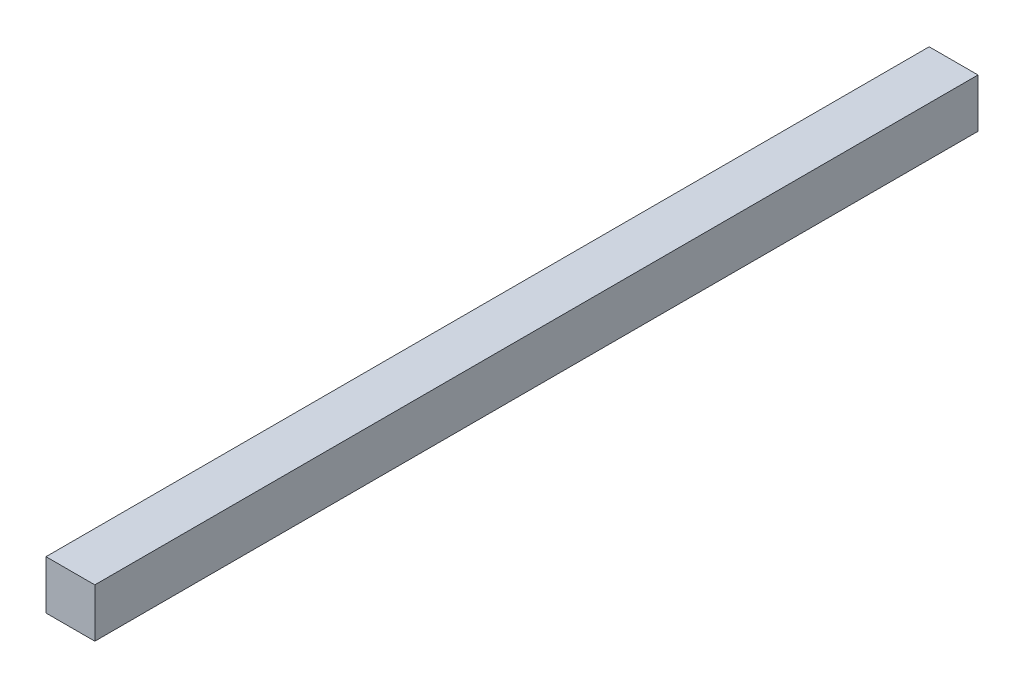
ISO-10303-21;
HEADER;
FILE_DESCRIPTION(('STEP AP214'),'2;1');
FILE_NAME('part.step','',(''),(''),'','','');
FILE_SCHEMA(('AUTOMOTIVE_DESIGN { 1 0 10303 214 1 1 1 1 }'));
ENDSEC;
DATA;
#1=APPLICATION_CONTEXT('core data for automotive mechanical design processes');
#2=APPLICATION_PROTOCOL_DEFINITION('international standard','automotive_design',2000,#1);
#3=PRODUCT_CONTEXT('',#1,'mechanical');
#4=PRODUCT('Part','Part','',(#3));
#5=PRODUCT_RELATED_PRODUCT_CATEGORY('part','',(#4));
#6=PRODUCT_DEFINITION_FORMATION('','',#4);
#7=PRODUCT_DEFINITION_CONTEXT('part definition',#1,'design');
#8=PRODUCT_DEFINITION('design','',#6,#7);
#9=PRODUCT_DEFINITION_SHAPE('','',#8);
#10=(LENGTH_UNIT() NAMED_UNIT(*) SI_UNIT(.MILLI.,.METRE.));
#11=(NAMED_UNIT(*) PLANE_ANGLE_UNIT() SI_UNIT($,.RADIAN.));
#12=(NAMED_UNIT(*) SI_UNIT($,.STERADIAN.) SOLID_ANGLE_UNIT());
#13=UNCERTAINTY_MEASURE_WITH_UNIT(LENGTH_MEASURE(1.E-05),#10,'distance_accuracy_value','');
#14=(GEOMETRIC_REPRESENTATION_CONTEXT(3) GLOBAL_UNCERTAINTY_ASSIGNED_CONTEXT((#13)) GLOBAL_UNIT_ASSIGNED_CONTEXT((#10,
#11,#12)) REPRESENTATION_CONTEXT('',''));
#15=CARTESIAN_POINT('',(0.,0.,0.));
#16=DIRECTION('',(0.,0.,1.));
#17=DIRECTION('',(1.,0.,0.));
#18=AXIS2_PLACEMENT_3D('',#15,#16,#17);
#19=CARTESIAN_POINT('',(4.975,4.975,180.));
#20=DIRECTION('',(-1.,0.,0.));
#21=DIRECTION('',(0.,-1.,0.));
#22=AXIS2_PLACEMENT_3D('',#19,#20,#21);
#23=PLANE('',#22);
#24=DIRECTION('',(0.,1.,0.));
#25=VECTOR('',#24,1.);
#26=CARTESIAN_POINT('',(4.975,4.975,0.));
#27=LINE('',#26,#25);
#28=CARTESIAN_POINT('',(4.975,-4.97499999999999,0.));
#29=VERTEX_POINT('',#28);
#30=CARTESIAN_POINT('',(4.975,4.975,0.));
#31=VERTEX_POINT('',#30);
#32=EDGE_CURVE('E98',#29,#31,#27,.T.);
#33=ORIENTED_EDGE('',*,*,#32,.T.);
#34=DIRECTION('',(0.,0.,-1.));
#35=VECTOR('',#34,1.);
#36=CARTESIAN_POINT('',(4.975,4.975,180.));
#37=LINE('',#36,#35);
#38=CARTESIAN_POINT('',(4.975,4.975,180.));
#39=VERTEX_POINT('',#38);
#40=EDGE_CURVE('E11',#39,#31,#37,.T.);
#41=ORIENTED_EDGE('',*,*,#40,.F.);
#42=DIRECTION('',(0.,1.,0.));
#43=VECTOR('',#42,1.);
#44=CARTESIAN_POINT('',(4.975,4.975,180.));
#45=LINE('',#44,#43);
#46=CARTESIAN_POINT('',(4.975,-4.97499999999999,180.));
#47=VERTEX_POINT('',#46);
#48=EDGE_CURVE('E86',#47,#39,#45,.T.);
#49=ORIENTED_EDGE('',*,*,#48,.F.);
#50=DIRECTION('',(0.,0.,-1.));
#51=VECTOR('',#50,1.);
#52=CARTESIAN_POINT('',(4.975,-4.97499999999999,180.));
#53=LINE('',#52,#51);
#54=EDGE_CURVE('E94',#47,#29,#53,.T.);
#55=ORIENTED_EDGE('',*,*,#54,.T.);
#56=EDGE_LOOP('',(#33,#41,#49,#55));
#57=FACE_BOUND('',#56,.T.);
#58=ADVANCED_FACE('F35',(#57),#23,.F.);
#59=CARTESIAN_POINT('',(-4.975,4.975,180.));
#60=DIRECTION('',(0.,-1.,0.));
#61=DIRECTION('',(0.,0.,-1.));
#62=AXIS2_PLACEMENT_3D('',#59,#60,#61);
#63=PLANE('',#62);
#64=DIRECTION('',(-1.,0.,0.));
#65=VECTOR('',#64,1.);
#66=CARTESIAN_POINT('',(-4.975,4.975,0.));
#67=LINE('',#66,#65);
#68=CARTESIAN_POINT('',(-4.975,4.975,0.));
#69=VERTEX_POINT('',#68);
#70=EDGE_CURVE('E90',#31,#69,#67,.T.);
#71=ORIENTED_EDGE('',*,*,#70,.T.);
#72=DIRECTION('',(0.,0.,-1.));
#73=VECTOR('',#72,1.);
#74=CARTESIAN_POINT('',(-4.975,4.975,180.));
#75=LINE('',#74,#73);
#76=CARTESIAN_POINT('',(-4.975,4.975,180.));
#77=VERTEX_POINT('',#76);
#78=EDGE_CURVE('E43',#77,#69,#75,.T.);
#79=ORIENTED_EDGE('',*,*,#78,.F.);
#80=DIRECTION('',(-1.,0.,0.));
#81=VECTOR('',#80,1.);
#82=CARTESIAN_POINT('',(-4.975,4.975,180.));
#83=LINE('',#82,#81);
#84=EDGE_CURVE('E81',#39,#77,#83,.T.);
#85=ORIENTED_EDGE('',*,*,#84,.F.);
#86=ORIENTED_EDGE('',*,*,#40,.T.);
#87=EDGE_LOOP('',(#71,#79,#85,#86));
#88=FACE_BOUND('',#87,.T.);
#89=ADVANCED_FACE('F89',(#88),#63,.F.);
#90=CARTESIAN_POINT('',(-4.975,4.975,180.));
#91=DIRECTION('',(1.,0.,0.));
#92=DIRECTION('',(0.,1.,0.));
#93=AXIS2_PLACEMENT_3D('',#90,#91,#92);
#94=PLANE('',#93);
#95=DIRECTION('',(0.,-1.,0.));
#96=VECTOR('',#95,1.);
#97=CARTESIAN_POINT('',(-4.975,4.975,0.));
#98=LINE('',#97,#96);
#99=CARTESIAN_POINT('',(-4.975,-4.975,0.));
#100=VERTEX_POINT('',#99);
#101=EDGE_CURVE('E68',#69,#100,#98,.T.);
#102=ORIENTED_EDGE('',*,*,#101,.T.);
#103=DIRECTION('',(0.,0.,-1.));
#104=VECTOR('',#103,1.);
#105=CARTESIAN_POINT('',(-4.975,-4.975,180.));
#106=LINE('',#105,#104);
#107=CARTESIAN_POINT('',(-4.975,-4.975,180.));
#108=VERTEX_POINT('',#107);
#109=EDGE_CURVE('E91',#108,#100,#106,.T.);
#110=ORIENTED_EDGE('',*,*,#109,.F.);
#111=DIRECTION('',(0.,-1.,0.));
#112=VECTOR('',#111,1.);
#113=CARTESIAN_POINT('',(-4.975,4.975,180.));
#114=LINE('',#113,#112);
#115=EDGE_CURVE('E84',#77,#108,#114,.T.);
#116=ORIENTED_EDGE('',*,*,#115,.F.);
#117=ORIENTED_EDGE('',*,*,#78,.T.);
#118=EDGE_LOOP('',(#102,#110,#116,#117));
#119=FACE_BOUND('',#118,.T.);
#120=ADVANCED_FACE('F92',(#119),#94,.F.);
#121=CARTESIAN_POINT('',(-4.975,-4.975,180.));
#122=DIRECTION('',(0.,1.,0.));
#123=DIRECTION('',(-1.,0.,0.));
#124=AXIS2_PLACEMENT_3D('',#121,#122,#123);
#125=PLANE('',#124);
#126=DIRECTION('',(1.,0.,0.));
#127=VECTOR('',#126,1.);
#128=CARTESIAN_POINT('',(-4.975,-4.975,0.));
#129=LINE('',#128,#127);
#130=EDGE_CURVE('E74',#100,#29,#129,.T.);
#131=ORIENTED_EDGE('',*,*,#130,.T.);
#132=ORIENTED_EDGE('',*,*,#54,.F.);
#133=DIRECTION('',(1.,0.,0.));
#134=VECTOR('',#133,1.);
#135=CARTESIAN_POINT('',(-4.975,-4.975,180.));
#136=LINE('',#135,#134);
#137=EDGE_CURVE('E51',#108,#47,#136,.T.);
#138=ORIENTED_EDGE('',*,*,#137,.F.);
#139=ORIENTED_EDGE('',*,*,#109,.T.);
#140=EDGE_LOOP('',(#131,#132,#138,#139));
#141=FACE_BOUND('',#140,.T.);
#142=ADVANCED_FACE('F105',(#141),#125,.F.);
#143=CARTESIAN_POINT('',(0.,0.,180.));
#144=DIRECTION('',(0.,0.,1.));
#145=DIRECTION('',(1.,0.,0.));
#146=AXIS2_PLACEMENT_3D('',#143,#144,#145);
#147=PLANE('',#146);
#148=ORIENTED_EDGE('',*,*,#48,.T.);
#149=ORIENTED_EDGE('',*,*,#84,.T.);
#150=ORIENTED_EDGE('',*,*,#115,.T.);
#151=ORIENTED_EDGE('',*,*,#137,.T.);
#152=EDGE_LOOP('',(#148,#149,#150,#151));
#153=FACE_BOUND('',#152,.T.);
#154=ADVANCED_FACE('F82',(#153),#147,.T.);
#155=CARTESIAN_POINT('',(0.,0.,0.));
#156=DIRECTION('',(0.,0.,1.));
#157=DIRECTION('',(1.,0.,0.));
#158=AXIS2_PLACEMENT_3D('',#155,#156,#157);
#159=PLANE('',#158);
#160=ORIENTED_EDGE('',*,*,#32,.F.);
#161=ORIENTED_EDGE('',*,*,#130,.F.);
#162=ORIENTED_EDGE('',*,*,#101,.F.);
#163=ORIENTED_EDGE('',*,*,#70,.F.);
#164=EDGE_LOOP('',(#160,#161,#162,#163));
#165=FACE_BOUND('',#164,.T.);
#166=ADVANCED_FACE('F108',(#165),#159,.F.);
#167=CLOSED_SHELL('',(#58,#89,#120,#142,#154,#166));
#168=MANIFOLD_SOLID_BREP('B2',#167);
#169=ADVANCED_BREP_SHAPE_REPRESENTATION('',(#18,#168),#14);
#170=SHAPE_DEFINITION_REPRESENTATION(#9,#169);
ENDSEC;
END-ISO-10303-21;
